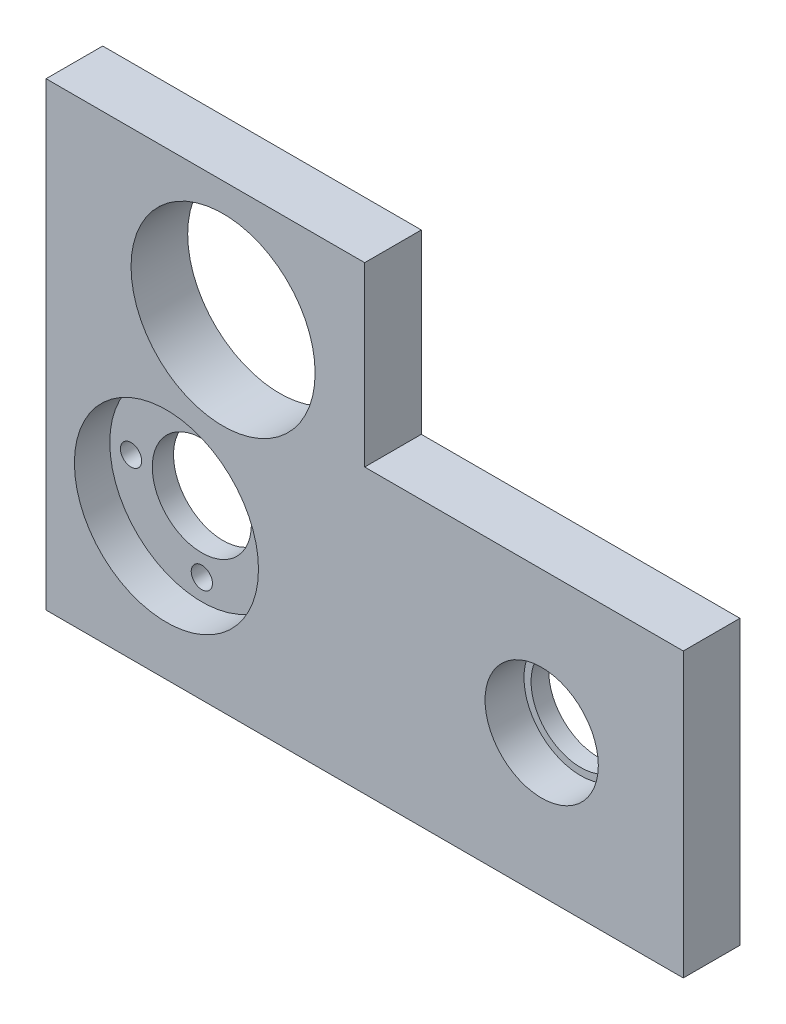
ISO-10303-21;
HEADER;
FILE_DESCRIPTION(('STEP AP214'),'2;1');
FILE_NAME('part.step','',(''),(''),'','','');
FILE_SCHEMA(('AUTOMOTIVE_DESIGN { 1 0 10303 214 1 1 1 1 }'));
ENDSEC;
DATA;
#1=APPLICATION_CONTEXT('core data for automotive mechanical design processes');
#2=APPLICATION_PROTOCOL_DEFINITION('international standard','automotive_design',2000,#1);
#3=PRODUCT_CONTEXT('',#1,'mechanical');
#4=PRODUCT('Part','Part','',(#3));
#5=PRODUCT_RELATED_PRODUCT_CATEGORY('part','',(#4));
#6=PRODUCT_DEFINITION_FORMATION('','',#4);
#7=PRODUCT_DEFINITION_CONTEXT('part definition',#1,'design');
#8=PRODUCT_DEFINITION('design','',#6,#7);
#9=PRODUCT_DEFINITION_SHAPE('','',#8);
#10=(LENGTH_UNIT() NAMED_UNIT(*) SI_UNIT(.MILLI.,.METRE.));
#11=(NAMED_UNIT(*) PLANE_ANGLE_UNIT() SI_UNIT($,.RADIAN.));
#12=(NAMED_UNIT(*) SI_UNIT($,.STERADIAN.) SOLID_ANGLE_UNIT());
#13=UNCERTAINTY_MEASURE_WITH_UNIT(LENGTH_MEASURE(1.E-05),#10,'distance_accuracy_value','');
#14=(GEOMETRIC_REPRESENTATION_CONTEXT(3) GLOBAL_UNCERTAINTY_ASSIGNED_CONTEXT((#13)) GLOBAL_UNIT_ASSIGNED_CONTEXT((#10,
#11,#12)) REPRESENTATION_CONTEXT('',''));
#15=CARTESIAN_POINT('',(0.,0.,0.));
#16=DIRECTION('',(0.,0.,1.));
#17=DIRECTION('',(1.,0.,0.));
#18=AXIS2_PLACEMENT_3D('',#15,#16,#17);
#19=CARTESIAN_POINT('',(70.,20.,8.));
#20=DIRECTION('',(0.,0.,-1.));
#21=DIRECTION('',(-1.,0.,0.));
#22=AXIS2_PLACEMENT_3D('',#19,#20,#21);
#23=CYLINDRICAL_SURFACE('',#22,7.);
#24=CARTESIAN_POINT('',(70.,20.,0.));
#25=DIRECTION('',(0.,0.,1.));
#26=DIRECTION('',(1.,0.,0.));
#27=AXIS2_PLACEMENT_3D('',#24,#25,#26);
#28=CIRCLE('',#27,7.);
#29=CARTESIAN_POINT('',(77.,20.,0.));
#30=VERTEX_POINT('',#29);
#31=EDGE_CURVE('E169',#30,#30,#28,.T.);
#32=ORIENTED_EDGE('',*,*,#31,.F.);
#33=EDGE_LOOP('',(#32));
#34=FACE_BOUND('',#33,.T.);
#35=CARTESIAN_POINT('',(70.,20.,2.5));
#36=DIRECTION('',(0.,0.,1.));
#37=DIRECTION('',(1.,0.,0.));
#38=AXIS2_PLACEMENT_3D('',#35,#36,#37);
#39=CIRCLE('',#38,7.);
#40=CARTESIAN_POINT('',(77.,20.,2.5));
#41=VERTEX_POINT('',#40);
#42=EDGE_CURVE('E37',#41,#41,#39,.T.);
#43=ORIENTED_EDGE('',*,*,#42,.T.);
#44=EDGE_LOOP('',(#43));
#45=FACE_BOUND('',#44,.T.);
#46=ADVANCED_FACE('F33',(#34,#45),#23,.F.);
#47=CARTESIAN_POINT('',(17.,20.,8.));
#48=DIRECTION('',(0.,0.,-1.));
#49=DIRECTION('',(-1.,0.,0.));
#50=AXIS2_PLACEMENT_3D('',#47,#48,#49);
#51=CYLINDRICAL_SURFACE('',#50,13.);
#52=CARTESIAN_POINT('',(17.,20.,8.));
#53=DIRECTION('',(0.,0.,1.));
#54=DIRECTION('',(1.,0.,0.));
#55=AXIS2_PLACEMENT_3D('',#52,#53,#54);
#56=CIRCLE('',#55,13.);
#57=CARTESIAN_POINT('',(30.,20.,8.));
#58=VERTEX_POINT('',#57);
#59=EDGE_CURVE('E164',#58,#58,#56,.T.);
#60=ORIENTED_EDGE('',*,*,#59,.T.);
#61=EDGE_LOOP('',(#60));
#62=FACE_BOUND('',#61,.T.);
#63=CARTESIAN_POINT('',(17.,20.,3.));
#64=DIRECTION('',(0.,0.,-1.));
#65=DIRECTION('',(-1.,0.,0.));
#66=AXIS2_PLACEMENT_3D('',#63,#64,#65);
#67=CIRCLE('',#66,13.);
#68=CARTESIAN_POINT('',(4.00000000000001,20.,3.));
#69=VERTEX_POINT('',#68);
#70=EDGE_CURVE('E155',#69,#69,#67,.T.);
#71=ORIENTED_EDGE('',*,*,#70,.T.);
#72=EDGE_LOOP('',(#71));
#73=FACE_BOUND('',#72,.T.);
#74=ADVANCED_FACE('F201',(#62,#73),#51,.F.);
#75=CARTESIAN_POINT('',(0.,0.,8.));
#76=DIRECTION('',(0.,0.,-1.));
#77=DIRECTION('',(-1.,0.,0.));
#78=AXIS2_PLACEMENT_3D('',#75,#76,#77);
#79=PLANE('',#78);
#80=CARTESIAN_POINT('',(70.,20.,8.));
#81=DIRECTION('',(0.,0.,1.));
#82=DIRECTION('',(1.,0.,0.));
#83=AXIS2_PLACEMENT_3D('',#80,#81,#82);
#84=CIRCLE('',#83,8.00000000000001);
#85=CARTESIAN_POINT('',(78.,20.,8.));
#86=VERTEX_POINT('',#85);
#87=EDGE_CURVE('E120',#86,#86,#84,.T.);
#88=ORIENTED_EDGE('',*,*,#87,.F.);
#89=EDGE_LOOP('',(#88));
#90=FACE_BOUND('',#89,.T.);
#91=DIRECTION('',(1.,0.,0.));
#92=VECTOR('',#91,1.);
#93=CARTESIAN_POINT('',(45.,40.,8.));
#94=LINE('',#93,#92);
#95=CARTESIAN_POINT('',(45.,40.,8.));
#96=VERTEX_POINT('',#95);
#97=CARTESIAN_POINT('',(90.,40.,8.));
#98=VERTEX_POINT('',#97);
#99=EDGE_CURVE('E113',#96,#98,#94,.T.);
#100=ORIENTED_EDGE('',*,*,#99,.F.);
#101=DIRECTION('',(0.,-1.,0.));
#102=VECTOR('',#101,1.);
#103=CARTESIAN_POINT('',(45.,65.,8.));
#104=LINE('',#103,#102);
#105=CARTESIAN_POINT('',(45.,65.,8.));
#106=VERTEX_POINT('',#105);
#107=EDGE_CURVE('E97',#106,#96,#104,.T.);
#108=ORIENTED_EDGE('',*,*,#107,.F.);
#109=DIRECTION('',(-1.,0.,0.));
#110=VECTOR('',#109,1.);
#111=CARTESIAN_POINT('',(0.,65.,8.));
#112=LINE('',#111,#110);
#113=CARTESIAN_POINT('',(0.,65.,8.));
#114=VERTEX_POINT('',#113);
#115=EDGE_CURVE('E58',#106,#114,#112,.T.);
#116=ORIENTED_EDGE('',*,*,#115,.T.);
#117=DIRECTION('',(0.,-1.,0.));
#118=VECTOR('',#117,1.);
#119=CARTESIAN_POINT('',(0.,0.,8.));
#120=LINE('',#119,#118);
#121=CARTESIAN_POINT('',(0.,0.,8.));
#122=VERTEX_POINT('',#121);
#123=EDGE_CURVE('E173',#114,#122,#120,.T.);
#124=ORIENTED_EDGE('',*,*,#123,.T.);
#125=DIRECTION('',(1.,0.,0.));
#126=VECTOR('',#125,1.);
#127=CARTESIAN_POINT('',(0.,0.,8.));
#128=LINE('',#127,#126);
#129=CARTESIAN_POINT('',(90.,0.,8.));
#130=VERTEX_POINT('',#129);
#131=EDGE_CURVE('E80',#122,#130,#128,.T.);
#132=ORIENTED_EDGE('',*,*,#131,.T.);
#133=DIRECTION('',(0.,1.,0.));
#134=VECTOR('',#133,1.);
#135=CARTESIAN_POINT('',(90.,0.,8.));
#136=LINE('',#135,#134);
#137=EDGE_CURVE('E176',#130,#98,#136,.T.);
#138=ORIENTED_EDGE('',*,*,#137,.T.);
#139=EDGE_LOOP('',(#100,#108,#116,#124,#132,#138));
#140=FACE_BOUND('',#139,.T.);
#141=ORIENTED_EDGE('',*,*,#59,.F.);
#142=EDGE_LOOP('',(#141));
#143=FACE_BOUND('',#142,.T.);
#144=CARTESIAN_POINT('',(25.,48.,8.));
#145=DIRECTION('',(0.,0.,1.));
#146=DIRECTION('',(1.,0.,0.));
#147=AXIS2_PLACEMENT_3D('',#144,#145,#146);
#148=CIRCLE('',#147,13.);
#149=CARTESIAN_POINT('',(38.,48.,8.));
#150=VERTEX_POINT('',#149);
#151=EDGE_CURVE('E161',#150,#150,#148,.T.);
#152=ORIENTED_EDGE('',*,*,#151,.F.);
#153=EDGE_LOOP('',(#152));
#154=FACE_BOUND('',#153,.T.);
#155=ADVANCED_FACE('F198',(#90,#140,#143,#154),#79,.F.);
#156=CARTESIAN_POINT('',(0.,0.,0.));
#157=DIRECTION('',(0.,0.,-1.));
#158=DIRECTION('',(-1.,0.,0.));
#159=AXIS2_PLACEMENT_3D('',#156,#157,#158);
#160=PLANE('',#159);
#161=DIRECTION('',(0.,-1.,0.));
#162=VECTOR('',#161,1.);
#163=CARTESIAN_POINT('',(45.,65.,0.));
#164=LINE('',#163,#162);
#165=CARTESIAN_POINT('',(45.,65.,0.));
#166=VERTEX_POINT('',#165);
#167=CARTESIAN_POINT('',(45.,40.,0.));
#168=VERTEX_POINT('',#167);
#169=EDGE_CURVE('E49',#166,#168,#164,.T.);
#170=ORIENTED_EDGE('',*,*,#169,.T.);
#171=DIRECTION('',(1.,0.,0.));
#172=VECTOR('',#171,1.);
#173=CARTESIAN_POINT('',(45.,40.,0.));
#174=LINE('',#173,#172);
#175=CARTESIAN_POINT('',(90.,40.,0.));
#176=VERTEX_POINT('',#175);
#177=EDGE_CURVE('E101',#168,#176,#174,.T.);
#178=ORIENTED_EDGE('',*,*,#177,.T.);
#179=DIRECTION('',(0.,1.,0.));
#180=VECTOR('',#179,1.);
#181=CARTESIAN_POINT('',(90.,0.,0.));
#182=LINE('',#181,#180);
#183=CARTESIAN_POINT('',(90.,0.,0.));
#184=VERTEX_POINT('',#183);
#185=EDGE_CURVE('E185',#184,#176,#182,.T.);
#186=ORIENTED_EDGE('',*,*,#185,.F.);
#187=DIRECTION('',(1.,0.,0.));
#188=VECTOR('',#187,1.);
#189=CARTESIAN_POINT('',(0.,0.,0.));
#190=LINE('',#189,#188);
#191=CARTESIAN_POINT('',(0.,0.,0.));
#192=VERTEX_POINT('',#191);
#193=EDGE_CURVE('E183',#192,#184,#190,.T.);
#194=ORIENTED_EDGE('',*,*,#193,.F.);
#195=DIRECTION('',(0.,-1.,0.));
#196=VECTOR('',#195,1.);
#197=CARTESIAN_POINT('',(0.,0.,0.));
#198=LINE('',#197,#196);
#199=CARTESIAN_POINT('',(0.,65.,0.));
#200=VERTEX_POINT('',#199);
#201=EDGE_CURVE('E172',#200,#192,#198,.T.);
#202=ORIENTED_EDGE('',*,*,#201,.F.);
#203=DIRECTION('',(-1.,0.,0.));
#204=VECTOR('',#203,1.);
#205=CARTESIAN_POINT('',(0.,65.,0.));
#206=LINE('',#205,#204);
#207=EDGE_CURVE('E75',#166,#200,#206,.T.);
#208=ORIENTED_EDGE('',*,*,#207,.F.);
#209=EDGE_LOOP('',(#170,#178,#186,#194,#202,#208));
#210=FACE_BOUND('',#209,.T.);
#211=CARTESIAN_POINT('',(17.,30.,0.));
#212=DIRECTION('',(0.,0.,1.));
#213=DIRECTION('',(1.,0.,0.));
#214=AXIS2_PLACEMENT_3D('',#211,#212,#213);
#215=CIRCLE('',#214,1.5);
#216=CARTESIAN_POINT('',(18.5,30.,0.));
#217=VERTEX_POINT('',#216);
#218=EDGE_CURVE('E134',#217,#217,#215,.T.);
#219=ORIENTED_EDGE('',*,*,#218,.T.);
#220=EDGE_LOOP('',(#219));
#221=FACE_BOUND('',#220,.T.);
#222=CARTESIAN_POINT('',(7.00000000000001,20.,0.));
#223=DIRECTION('',(0.,0.,1.));
#224=DIRECTION('',(1.,0.,0.));
#225=AXIS2_PLACEMENT_3D('',#222,#223,#224);
#226=CIRCLE('',#225,1.5);
#227=CARTESIAN_POINT('',(8.50000000000001,20.,0.));
#228=VERTEX_POINT('',#227);
#229=EDGE_CURVE('E127',#228,#228,#226,.T.);
#230=ORIENTED_EDGE('',*,*,#229,.T.);
#231=EDGE_LOOP('',(#230));
#232=FACE_BOUND('',#231,.T.);
#233=CARTESIAN_POINT('',(17.,10.,0.));
#234=DIRECTION('',(0.,0.,1.));
#235=DIRECTION('',(1.,0.,0.));
#236=AXIS2_PLACEMENT_3D('',#233,#234,#235);
#237=CIRCLE('',#236,1.5);
#238=CARTESIAN_POINT('',(18.5,10.,0.));
#239=VERTEX_POINT('',#238);
#240=EDGE_CURVE('E147',#239,#239,#237,.T.);
#241=ORIENTED_EDGE('',*,*,#240,.T.);
#242=EDGE_LOOP('',(#241));
#243=FACE_BOUND('',#242,.T.);
#244=CARTESIAN_POINT('',(27.,20.,0.));
#245=DIRECTION('',(0.,0.,1.));
#246=DIRECTION('',(1.,0.,0.));
#247=AXIS2_PLACEMENT_3D('',#244,#245,#246);
#248=CIRCLE('',#247,1.5);
#249=CARTESIAN_POINT('',(28.5,20.,0.));
#250=VERTEX_POINT('',#249);
#251=EDGE_CURVE('E140',#250,#250,#248,.T.);
#252=ORIENTED_EDGE('',*,*,#251,.T.);
#253=EDGE_LOOP('',(#252));
#254=FACE_BOUND('',#253,.T.);
#255=CARTESIAN_POINT('',(17.,20.,0.));
#256=DIRECTION('',(0.,0.,1.));
#257=DIRECTION('',(1.,0.,0.));
#258=AXIS2_PLACEMENT_3D('',#255,#256,#257);
#259=CIRCLE('',#258,7.);
#260=CARTESIAN_POINT('',(24.,20.,0.));
#261=VERTEX_POINT('',#260);
#262=EDGE_CURVE('E152',#261,#261,#259,.T.);
#263=ORIENTED_EDGE('',*,*,#262,.T.);
#264=EDGE_LOOP('',(#263));
#265=FACE_BOUND('',#264,.T.);
#266=ORIENTED_EDGE('',*,*,#31,.T.);
#267=EDGE_LOOP('',(#266));
#268=FACE_BOUND('',#267,.T.);
#269=CARTESIAN_POINT('',(25.,48.,0.));
#270=DIRECTION('',(0.,0.,1.));
#271=DIRECTION('',(1.,0.,0.));
#272=AXIS2_PLACEMENT_3D('',#269,#270,#271);
#273=CIRCLE('',#272,13.);
#274=CARTESIAN_POINT('',(38.,48.,0.));
#275=VERTEX_POINT('',#274);
#276=EDGE_CURVE('E160',#275,#275,#273,.T.);
#277=ORIENTED_EDGE('',*,*,#276,.T.);
#278=EDGE_LOOP('',(#277));
#279=FACE_BOUND('',#278,.T.);
#280=ADVANCED_FACE('F110',(#210,#221,#232,#243,#254,#265,#268,#279),#160,.T.);
#281=CARTESIAN_POINT('',(0.,0.,8.));
#282=DIRECTION('',(1.,0.,0.));
#283=DIRECTION('',(0.,0.,-1.));
#284=AXIS2_PLACEMENT_3D('',#281,#282,#283);
#285=PLANE('',#284);
#286=ORIENTED_EDGE('',*,*,#201,.T.);
#287=DIRECTION('',(0.,0.,-1.));
#288=VECTOR('',#287,1.);
#289=CARTESIAN_POINT('',(0.,0.,8.));
#290=LINE('',#289,#288);
#291=EDGE_CURVE('E11',#122,#192,#290,.T.);
#292=ORIENTED_EDGE('',*,*,#291,.F.);
#293=ORIENTED_EDGE('',*,*,#123,.F.);
#294=DIRECTION('',(0.,0.,-1.));
#295=VECTOR('',#294,1.);
#296=CARTESIAN_POINT('',(0.,65.,8.));
#297=LINE('',#296,#295);
#298=EDGE_CURVE('E180',#114,#200,#297,.T.);
#299=ORIENTED_EDGE('',*,*,#298,.T.);
#300=EDGE_LOOP('',(#286,#292,#293,#299));
#301=FACE_BOUND('',#300,.T.);
#302=ADVANCED_FACE('F35',(#301),#285,.F.);
#303=CARTESIAN_POINT('',(0.,0.,8.));
#304=DIRECTION('',(0.,1.,0.));
#305=DIRECTION('',(0.,0.,1.));
#306=AXIS2_PLACEMENT_3D('',#303,#304,#305);
#307=PLANE('',#306);
#308=ORIENTED_EDGE('',*,*,#193,.T.);
#309=DIRECTION('',(0.,0.,-1.));
#310=VECTOR('',#309,1.);
#311=CARTESIAN_POINT('',(90.,0.,8.));
#312=LINE('',#311,#310);
#313=EDGE_CURVE('E42',#130,#184,#312,.T.);
#314=ORIENTED_EDGE('',*,*,#313,.F.);
#315=ORIENTED_EDGE('',*,*,#131,.F.);
#316=ORIENTED_EDGE('',*,*,#291,.T.);
#317=EDGE_LOOP('',(#308,#314,#315,#316));
#318=FACE_BOUND('',#317,.T.);
#319=ADVANCED_FACE('F194',(#318),#307,.F.);
#320=CARTESIAN_POINT('',(90.,0.,8.));
#321=DIRECTION('',(-1.,0.,0.));
#322=DIRECTION('',(0.,0.,1.));
#323=AXIS2_PLACEMENT_3D('',#320,#321,#322);
#324=PLANE('',#323);
#325=ORIENTED_EDGE('',*,*,#185,.T.);
#326=DIRECTION('',(0.,0.,1.));
#327=VECTOR('',#326,1.);
#328=CARTESIAN_POINT('',(90.,40.,0.));
#329=LINE('',#328,#327);
#330=EDGE_CURVE('E100',#176,#98,#329,.T.);
#331=ORIENTED_EDGE('',*,*,#330,.T.);
#332=ORIENTED_EDGE('',*,*,#137,.F.);
#333=ORIENTED_EDGE('',*,*,#313,.T.);
#334=EDGE_LOOP('',(#325,#331,#332,#333));
#335=FACE_BOUND('',#334,.T.);
#336=ADVANCED_FACE('F192',(#335),#324,.F.);
#337=CARTESIAN_POINT('',(0.,65.,8.));
#338=DIRECTION('',(0.,-1.,0.));
#339=DIRECTION('',(0.,0.,-1.));
#340=AXIS2_PLACEMENT_3D('',#337,#338,#339);
#341=PLANE('',#340);
#342=ORIENTED_EDGE('',*,*,#115,.F.);
#343=DIRECTION('',(0.,0.,1.));
#344=VECTOR('',#343,1.);
#345=CARTESIAN_POINT('',(45.,65.,0.));
#346=LINE('',#345,#344);
#347=EDGE_CURVE('E118',#166,#106,#346,.T.);
#348=ORIENTED_EDGE('',*,*,#347,.F.);
#349=ORIENTED_EDGE('',*,*,#207,.T.);
#350=ORIENTED_EDGE('',*,*,#298,.F.);
#351=EDGE_LOOP('',(#342,#348,#349,#350));
#352=FACE_BOUND('',#351,.T.);
#353=ADVANCED_FACE('F197',(#352),#341,.F.);
#354=CARTESIAN_POINT('',(25.,48.,8.));
#355=DIRECTION('',(0.,0.,-1.));
#356=DIRECTION('',(-1.,0.,0.));
#357=AXIS2_PLACEMENT_3D('',#354,#355,#356);
#358=CYLINDRICAL_SURFACE('',#357,13.);
#359=ORIENTED_EDGE('',*,*,#151,.T.);
#360=EDGE_LOOP('',(#359));
#361=FACE_BOUND('',#360,.T.);
#362=ORIENTED_EDGE('',*,*,#276,.F.);
#363=EDGE_LOOP('',(#362));
#364=FACE_BOUND('',#363,.T.);
#365=ADVANCED_FACE('F208',(#361,#364),#358,.F.);
#366=CARTESIAN_POINT('',(17.,20.,3.));
#367=DIRECTION('',(0.,0.,-1.));
#368=DIRECTION('',(-1.,0.,0.));
#369=AXIS2_PLACEMENT_3D('',#366,#367,#368);
#370=PLANE('',#369);
#371=CARTESIAN_POINT('',(17.,30.,3.));
#372=DIRECTION('',(0.,0.,1.));
#373=DIRECTION('',(1.,0.,0.));
#374=AXIS2_PLACEMENT_3D('',#371,#372,#373);
#375=CIRCLE('',#374,1.5);
#376=CARTESIAN_POINT('',(18.5,30.,3.));
#377=VERTEX_POINT('',#376);
#378=EDGE_CURVE('E137',#377,#377,#375,.T.);
#379=ORIENTED_EDGE('',*,*,#378,.F.);
#380=EDGE_LOOP('',(#379));
#381=FACE_BOUND('',#380,.T.);
#382=CARTESIAN_POINT('',(7.00000000000001,20.,3.));
#383=DIRECTION('',(0.,0.,1.));
#384=DIRECTION('',(1.,0.,0.));
#385=AXIS2_PLACEMENT_3D('',#382,#383,#384);
#386=CIRCLE('',#385,1.5);
#387=CARTESIAN_POINT('',(8.50000000000001,20.,3.));
#388=VERTEX_POINT('',#387);
#389=EDGE_CURVE('E131',#388,#388,#386,.T.);
#390=ORIENTED_EDGE('',*,*,#389,.F.);
#391=EDGE_LOOP('',(#390));
#392=FACE_BOUND('',#391,.T.);
#393=CARTESIAN_POINT('',(17.,10.,3.));
#394=DIRECTION('',(0.,0.,1.));
#395=DIRECTION('',(1.,0.,0.));
#396=AXIS2_PLACEMENT_3D('',#393,#394,#395);
#397=CIRCLE('',#396,1.5);
#398=CARTESIAN_POINT('',(18.5,10.,3.));
#399=VERTEX_POINT('',#398);
#400=EDGE_CURVE('E130',#399,#399,#397,.T.);
#401=ORIENTED_EDGE('',*,*,#400,.F.);
#402=EDGE_LOOP('',(#401));
#403=FACE_BOUND('',#402,.T.);
#404=CARTESIAN_POINT('',(27.,20.,3.));
#405=DIRECTION('',(0.,0.,1.));
#406=DIRECTION('',(1.,0.,0.));
#407=AXIS2_PLACEMENT_3D('',#404,#405,#406);
#408=CIRCLE('',#407,1.5);
#409=CARTESIAN_POINT('',(28.5,20.,3.));
#410=VERTEX_POINT('',#409);
#411=EDGE_CURVE('E144',#410,#410,#408,.T.);
#412=ORIENTED_EDGE('',*,*,#411,.F.);
#413=EDGE_LOOP('',(#412));
#414=FACE_BOUND('',#413,.T.);
#415=CARTESIAN_POINT('',(17.,20.,3.));
#416=DIRECTION('',(0.,0.,1.));
#417=DIRECTION('',(1.,0.,0.));
#418=AXIS2_PLACEMENT_3D('',#415,#416,#417);
#419=CIRCLE('',#418,7.);
#420=CARTESIAN_POINT('',(24.,20.,3.));
#421=VERTEX_POINT('',#420);
#422=EDGE_CURVE('E143',#421,#421,#419,.T.);
#423=ORIENTED_EDGE('',*,*,#422,.F.);
#424=EDGE_LOOP('',(#423));
#425=FACE_BOUND('',#424,.T.);
#426=ORIENTED_EDGE('',*,*,#70,.F.);
#427=EDGE_LOOP('',(#426));
#428=FACE_BOUND('',#427,.T.);
#429=ADVANCED_FACE('F211',(#381,#392,#403,#414,#425,#428),#370,.F.);
#430=CARTESIAN_POINT('',(17.,20.,0.));
#431=DIRECTION('',(0.,0.,1.));
#432=DIRECTION('',(1.,0.,0.));
#433=AXIS2_PLACEMENT_3D('',#430,#431,#432);
#434=CYLINDRICAL_SURFACE('',#433,7.);
#435=ORIENTED_EDGE('',*,*,#262,.F.);
#436=EDGE_LOOP('',(#435));
#437=FACE_BOUND('',#436,.T.);
#438=ORIENTED_EDGE('',*,*,#422,.T.);
#439=EDGE_LOOP('',(#438));
#440=FACE_BOUND('',#439,.T.);
#441=ADVANCED_FACE('F234',(#437,#440),#434,.F.);
#442=CARTESIAN_POINT('',(27.,20.,0.));
#443=DIRECTION('',(0.,0.,1.));
#444=DIRECTION('',(1.,0.,0.));
#445=AXIS2_PLACEMENT_3D('',#442,#443,#444);
#446=CYLINDRICAL_SURFACE('',#445,1.5);
#447=ORIENTED_EDGE('',*,*,#251,.F.);
#448=EDGE_LOOP('',(#447));
#449=FACE_BOUND('',#448,.T.);
#450=ORIENTED_EDGE('',*,*,#411,.T.);
#451=EDGE_LOOP('',(#450));
#452=FACE_BOUND('',#451,.T.);
#453=ADVANCED_FACE('F238',(#449,#452),#446,.F.);
#454=CARTESIAN_POINT('',(17.,10.,0.));
#455=DIRECTION('',(0.,0.,1.));
#456=DIRECTION('',(1.,0.,0.));
#457=AXIS2_PLACEMENT_3D('',#454,#455,#456);
#458=CYLINDRICAL_SURFACE('',#457,1.5);
#459=ORIENTED_EDGE('',*,*,#240,.F.);
#460=EDGE_LOOP('',(#459));
#461=FACE_BOUND('',#460,.T.);
#462=ORIENTED_EDGE('',*,*,#400,.T.);
#463=EDGE_LOOP('',(#462));
#464=FACE_BOUND('',#463,.T.);
#465=ADVANCED_FACE('F240',(#461,#464),#458,.F.);
#466=CARTESIAN_POINT('',(7.00000000000001,20.,0.));
#467=DIRECTION('',(0.,0.,1.));
#468=DIRECTION('',(1.,0.,0.));
#469=AXIS2_PLACEMENT_3D('',#466,#467,#468);
#470=CYLINDRICAL_SURFACE('',#469,1.5);
#471=ORIENTED_EDGE('',*,*,#229,.F.);
#472=EDGE_LOOP('',(#471));
#473=FACE_BOUND('',#472,.T.);
#474=ORIENTED_EDGE('',*,*,#389,.T.);
#475=EDGE_LOOP('',(#474));
#476=FACE_BOUND('',#475,.T.);
#477=ADVANCED_FACE('F243',(#473,#476),#470,.F.);
#478=CARTESIAN_POINT('',(17.,30.,0.));
#479=DIRECTION('',(0.,0.,1.));
#480=DIRECTION('',(1.,0.,0.));
#481=AXIS2_PLACEMENT_3D('',#478,#479,#480);
#482=CYLINDRICAL_SURFACE('',#481,1.5);
#483=ORIENTED_EDGE('',*,*,#218,.F.);
#484=EDGE_LOOP('',(#483));
#485=FACE_BOUND('',#484,.T.);
#486=ORIENTED_EDGE('',*,*,#378,.T.);
#487=EDGE_LOOP('',(#486));
#488=FACE_BOUND('',#487,.T.);
#489=ADVANCED_FACE('F248',(#485,#488),#482,.F.);
#490=CARTESIAN_POINT('',(70.,20.,2.5));
#491=DIRECTION('',(0.,0.,1.));
#492=DIRECTION('',(1.,0.,0.));
#493=AXIS2_PLACEMENT_3D('',#490,#491,#492);
#494=CYLINDRICAL_SURFACE('',#493,8.00000000000001);
#495=CARTESIAN_POINT('',(70.,20.,2.5));
#496=DIRECTION('',(0.,0.,1.));
#497=DIRECTION('',(1.,0.,0.));
#498=AXIS2_PLACEMENT_3D('',#495,#496,#497);
#499=CIRCLE('',#498,8.00000000000001);
#500=CARTESIAN_POINT('',(78.,20.,2.5));
#501=VERTEX_POINT('',#500);
#502=EDGE_CURVE('E122',#501,#501,#499,.T.);
#503=ORIENTED_EDGE('',*,*,#502,.F.);
#504=EDGE_LOOP('',(#503));
#505=FACE_BOUND('',#504,.T.);
#506=ORIENTED_EDGE('',*,*,#87,.T.);
#507=EDGE_LOOP('',(#506));
#508=FACE_BOUND('',#507,.T.);
#509=ADVANCED_FACE('F251',(#505,#508),#494,.F.);
#510=CARTESIAN_POINT('',(70.,20.,2.5));
#511=DIRECTION('',(0.,0.,1.));
#512=DIRECTION('',(1.,0.,0.));
#513=AXIS2_PLACEMENT_3D('',#510,#511,#512);
#514=PLANE('',#513);
#515=ORIENTED_EDGE('',*,*,#42,.F.);
#516=EDGE_LOOP('',(#515));
#517=FACE_BOUND('',#516,.T.);
#518=ORIENTED_EDGE('',*,*,#502,.T.);
#519=EDGE_LOOP('',(#518));
#520=FACE_BOUND('',#519,.T.);
#521=ADVANCED_FACE('F258',(#517,#520),#514,.T.);
#522=CARTESIAN_POINT('',(45.,65.,0.));
#523=DIRECTION('',(-1.,0.,0.));
#524=DIRECTION('',(0.,0.,1.));
#525=AXIS2_PLACEMENT_3D('',#522,#523,#524);
#526=PLANE('',#525);
#527=ORIENTED_EDGE('',*,*,#107,.T.);
#528=DIRECTION('',(0.,0.,1.));
#529=VECTOR('',#528,1.);
#530=CARTESIAN_POINT('',(45.,40.,0.));
#531=LINE('',#530,#529);
#532=EDGE_CURVE('E94',#168,#96,#531,.T.);
#533=ORIENTED_EDGE('',*,*,#532,.F.);
#534=ORIENTED_EDGE('',*,*,#169,.F.);
#535=ORIENTED_EDGE('',*,*,#347,.T.);
#536=EDGE_LOOP('',(#527,#533,#534,#535));
#537=FACE_BOUND('',#536,.T.);
#538=ADVANCED_FACE('F96',(#537),#526,.F.);
#539=CARTESIAN_POINT('',(45.,40.,0.));
#540=DIRECTION('',(0.,-1.,0.));
#541=DIRECTION('',(0.,0.,-1.));
#542=AXIS2_PLACEMENT_3D('',#539,#540,#541);
#543=PLANE('',#542);
#544=ORIENTED_EDGE('',*,*,#99,.T.);
#545=ORIENTED_EDGE('',*,*,#330,.F.);
#546=ORIENTED_EDGE('',*,*,#177,.F.);
#547=ORIENTED_EDGE('',*,*,#532,.T.);
#548=EDGE_LOOP('',(#544,#545,#546,#547));
#549=FACE_BOUND('',#548,.T.);
#550=ADVANCED_FACE('F104',(#549),#543,.F.);
#551=CLOSED_SHELL('',(#46,#74,#155,#280,#302,#319,#336,#353,#365,#429,#441,#453,#465,#477,#489,
#509,#521,#538,#550));
#552=MANIFOLD_SOLID_BREP('B2',#551);
#553=ADVANCED_BREP_SHAPE_REPRESENTATION('',(#18,#552),#14);
#554=SHAPE_DEFINITION_REPRESENTATION(#9,#553);
ENDSEC;
END-ISO-10303-21;
